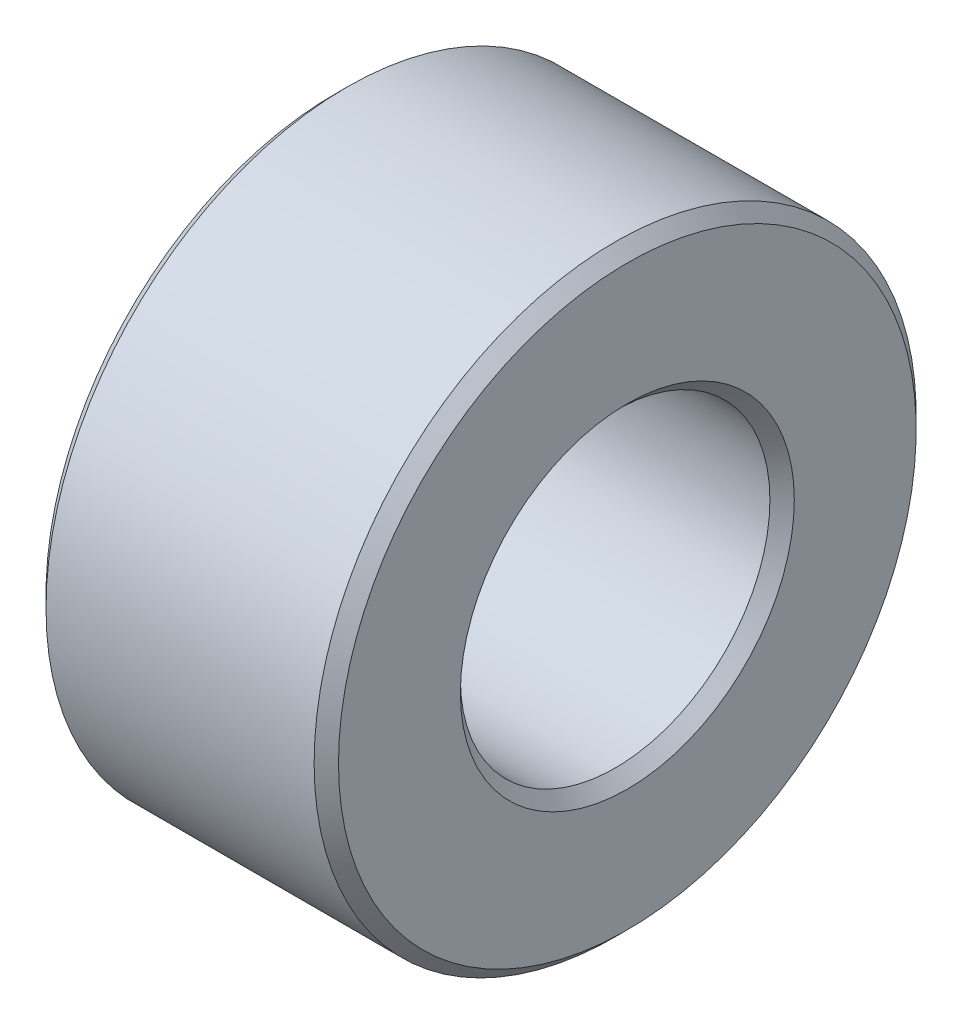
ISO-10303-21;
HEADER;
FILE_DESCRIPTION(('STEP AP214'),'2;1');
FILE_NAME('part.step','',(''),(''),'','','');
FILE_SCHEMA(('AUTOMOTIVE_DESIGN { 1 0 10303 214 1 1 1 1 }'));
ENDSEC;
DATA;
#1=APPLICATION_CONTEXT('core data for automotive mechanical design processes');
#2=APPLICATION_PROTOCOL_DEFINITION('international standard','automotive_design',2000,#1);
#3=PRODUCT_CONTEXT('',#1,'mechanical');
#4=PRODUCT('Part','Part','',(#3));
#5=PRODUCT_RELATED_PRODUCT_CATEGORY('part','',(#4));
#6=PRODUCT_DEFINITION_FORMATION('','',#4);
#7=PRODUCT_DEFINITION_CONTEXT('part definition',#1,'design');
#8=PRODUCT_DEFINITION('design','',#6,#7);
#9=PRODUCT_DEFINITION_SHAPE('','',#8);
#10=(LENGTH_UNIT() NAMED_UNIT(*) SI_UNIT(.MILLI.,.METRE.));
#11=(NAMED_UNIT(*) PLANE_ANGLE_UNIT() SI_UNIT($,.RADIAN.));
#12=(NAMED_UNIT(*) SI_UNIT($,.STERADIAN.) SOLID_ANGLE_UNIT());
#13=UNCERTAINTY_MEASURE_WITH_UNIT(LENGTH_MEASURE(1.E-05),#10,'distance_accuracy_value','');
#14=(GEOMETRIC_REPRESENTATION_CONTEXT(3) GLOBAL_UNCERTAINTY_ASSIGNED_CONTEXT((#13)) GLOBAL_UNIT_ASSIGNED_CONTEXT((#10,
#11,#12)) REPRESENTATION_CONTEXT('',''));
#15=CARTESIAN_POINT('',(0.,0.,0.));
#16=DIRECTION('',(0.,0.,1.));
#17=DIRECTION('',(1.,0.,0.));
#18=AXIS2_PLACEMENT_3D('',#15,#16,#17);
#19=CARTESIAN_POINT('',(-3.,3.175,0.));
#20=DIRECTION('',(1.,0.,0.));
#21=DIRECTION('',(0.,0.,-1.));
#22=AXIS2_PLACEMENT_3D('',#19,#20,#21);
#23=PLANE('',#22);
#24=CARTESIAN_POINT('',(-3.,0.,0.));
#25=DIRECTION('',(1.,0.,0.));
#26=DIRECTION('',(0.,0.,-1.));
#27=AXIS2_PLACEMENT_3D('',#24,#25,#26);
#28=CIRCLE('',#27,5.925);
#29=CARTESIAN_POINT('',(-3.,0.,-5.925));
#30=VERTEX_POINT('',#29);
#31=EDGE_CURVE('E58',#30,#30,#28,.F.);
#32=ORIENTED_EDGE('',*,*,#31,.T.);
#33=EDGE_LOOP('',(#32));
#34=FACE_BOUND('',#33,.T.);
#35=CARTESIAN_POINT('',(-3.,0.,0.));
#36=DIRECTION('',(1.,0.,0.));
#37=DIRECTION('',(0.,0.,-1.));
#38=AXIS2_PLACEMENT_3D('',#35,#36,#37);
#39=CIRCLE('',#38,3.425);
#40=CARTESIAN_POINT('',(-3.,0.,-3.425));
#41=VERTEX_POINT('',#40);
#42=EDGE_CURVE('E61',#41,#41,#39,.T.);
#43=ORIENTED_EDGE('',*,*,#42,.T.);
#44=EDGE_LOOP('',(#43));
#45=FACE_BOUND('',#44,.T.);
#46=ADVANCED_FACE('F32',(#34,#45),#23,.F.);
#47=CARTESIAN_POINT('',(0.,0.,0.));
#48=DIRECTION('',(-1.,0.,0.));
#49=DIRECTION('',(0.,0.,1.));
#50=AXIS2_PLACEMENT_3D('',#47,#48,#49);
#51=CYLINDRICAL_SURFACE('',#50,6.175);
#52=CARTESIAN_POINT('',(-2.75,0.,0.));
#53=DIRECTION('',(1.,0.,0.));
#54=DIRECTION('',(0.,0.,-1.));
#55=AXIS2_PLACEMENT_3D('',#52,#53,#54);
#56=CIRCLE('',#55,6.175);
#57=CARTESIAN_POINT('',(-2.75,0.,-6.175));
#58=VERTEX_POINT('',#57);
#59=EDGE_CURVE('E52',#58,#58,#56,.T.);
#60=ORIENTED_EDGE('',*,*,#59,.T.);
#61=EDGE_LOOP('',(#60));
#62=FACE_BOUND('',#61,.T.);
#63=CARTESIAN_POINT('',(2.75,0.,0.));
#64=DIRECTION('',(-1.,0.,0.));
#65=DIRECTION('',(0.,0.,1.));
#66=AXIS2_PLACEMENT_3D('',#63,#64,#65);
#67=CIRCLE('',#66,6.175);
#68=CARTESIAN_POINT('',(2.75,0.,6.175));
#69=VERTEX_POINT('',#68);
#70=EDGE_CURVE('E55',#69,#69,#67,.T.);
#71=ORIENTED_EDGE('',*,*,#70,.T.);
#72=EDGE_LOOP('',(#71));
#73=FACE_BOUND('',#72,.T.);
#74=ADVANCED_FACE('F88',(#62,#73),#51,.T.);
#75=CARTESIAN_POINT('',(3.,6.175,0.));
#76=DIRECTION('',(-1.,0.,0.));
#77=DIRECTION('',(0.,0.,1.));
#78=AXIS2_PLACEMENT_3D('',#75,#76,#77);
#79=PLANE('',#78);
#80=CARTESIAN_POINT('',(3.,0.,0.));
#81=DIRECTION('',(-1.,0.,0.));
#82=DIRECTION('',(0.,0.,1.));
#83=AXIS2_PLACEMENT_3D('',#80,#81,#82);
#84=CIRCLE('',#83,5.925);
#85=CARTESIAN_POINT('',(3.,0.,5.925));
#86=VERTEX_POINT('',#85);
#87=EDGE_CURVE('E10',#86,#86,#84,.F.);
#88=ORIENTED_EDGE('',*,*,#87,.T.);
#89=EDGE_LOOP('',(#88));
#90=FACE_BOUND('',#89,.T.);
#91=CARTESIAN_POINT('',(3.,0.,0.));
#92=DIRECTION('',(-1.,0.,0.));
#93=DIRECTION('',(0.,0.,1.));
#94=AXIS2_PLACEMENT_3D('',#91,#92,#93);
#95=CIRCLE('',#94,3.425);
#96=CARTESIAN_POINT('',(3.,0.,3.425));
#97=VERTEX_POINT('',#96);
#98=EDGE_CURVE('E39',#97,#97,#95,.T.);
#99=ORIENTED_EDGE('',*,*,#98,.T.);
#100=EDGE_LOOP('',(#99));
#101=FACE_BOUND('',#100,.T.);
#102=ADVANCED_FACE('F77',(#90,#101),#79,.F.);
#103=CARTESIAN_POINT('',(0.,0.,0.));
#104=DIRECTION('',(-1.,0.,0.));
#105=DIRECTION('',(0.,0.,1.));
#106=AXIS2_PLACEMENT_3D('',#103,#104,#105);
#107=CYLINDRICAL_SURFACE('',#106,3.175);
#108=CARTESIAN_POINT('',(-2.75,0.,0.));
#109=DIRECTION('',(1.,0.,0.));
#110=DIRECTION('',(0.,0.,-1.));
#111=AXIS2_PLACEMENT_3D('',#108,#109,#110);
#112=CIRCLE('',#111,3.175);
#113=CARTESIAN_POINT('',(-2.75,0.,-3.175));
#114=VERTEX_POINT('',#113);
#115=EDGE_CURVE('E43',#114,#114,#112,.F.);
#116=ORIENTED_EDGE('',*,*,#115,.T.);
#117=EDGE_LOOP('',(#116));
#118=FACE_BOUND('',#117,.T.);
#119=CARTESIAN_POINT('',(2.75,0.,0.));
#120=DIRECTION('',(-1.,0.,0.));
#121=DIRECTION('',(0.,0.,1.));
#122=AXIS2_PLACEMENT_3D('',#119,#120,#121);
#123=CIRCLE('',#122,3.175);
#124=CARTESIAN_POINT('',(2.75,0.,3.175));
#125=VERTEX_POINT('',#124);
#126=EDGE_CURVE('E47',#125,#125,#123,.F.);
#127=ORIENTED_EDGE('',*,*,#126,.T.);
#128=EDGE_LOOP('',(#127));
#129=FACE_BOUND('',#128,.T.);
#130=ADVANCED_FACE('F74',(#118,#129),#107,.F.);
#131=CARTESIAN_POINT('',(-3.,0.,0.));
#132=DIRECTION('',(1.,0.,0.));
#133=DIRECTION('',(0.,0.,-1.));
#134=AXIS2_PLACEMENT_3D('',#131,#132,#133);
#135=CONICAL_SURFACE('',#134,5.925,0.785398163397447);
#136=ORIENTED_EDGE('',*,*,#59,.F.);
#137=EDGE_LOOP('',(#136));
#138=FACE_BOUND('',#137,.T.);
#139=ORIENTED_EDGE('',*,*,#31,.F.);
#140=EDGE_LOOP('',(#139));
#141=FACE_BOUND('',#140,.T.);
#142=ADVANCED_FACE('F70',(#138,#141),#135,.T.);
#143=CARTESIAN_POINT('',(-2.75,0.,0.));
#144=DIRECTION('',(-1.,0.,0.));
#145=DIRECTION('',(0.,0.,1.));
#146=AXIS2_PLACEMENT_3D('',#143,#144,#145);
#147=CONICAL_SURFACE('',#146,3.175,0.785398163397447);
#148=ORIENTED_EDGE('',*,*,#42,.F.);
#149=EDGE_LOOP('',(#148));
#150=FACE_BOUND('',#149,.T.);
#151=ORIENTED_EDGE('',*,*,#115,.F.);
#152=EDGE_LOOP('',(#151));
#153=FACE_BOUND('',#152,.T.);
#154=ADVANCED_FACE('F66',(#150,#153),#147,.F.);
#155=CARTESIAN_POINT('',(2.75,0.,0.));
#156=DIRECTION('',(-1.,0.,0.));
#157=DIRECTION('',(0.,0.,1.));
#158=AXIS2_PLACEMENT_3D('',#155,#156,#157);
#159=CONICAL_SURFACE('',#158,6.175,0.78539816339745);
#160=ORIENTED_EDGE('',*,*,#87,.F.);
#161=EDGE_LOOP('',(#160));
#162=FACE_BOUND('',#161,.T.);
#163=ORIENTED_EDGE('',*,*,#70,.F.);
#164=EDGE_LOOP('',(#163));
#165=FACE_BOUND('',#164,.T.);
#166=ADVANCED_FACE('F69',(#162,#165),#159,.T.);
#167=CARTESIAN_POINT('',(3.,0.,0.));
#168=DIRECTION('',(1.,0.,0.));
#169=DIRECTION('',(0.,0.,-1.));
#170=AXIS2_PLACEMENT_3D('',#167,#168,#169);
#171=CONICAL_SURFACE('',#170,3.425,0.785398163397446);
#172=ORIENTED_EDGE('',*,*,#126,.F.);
#173=EDGE_LOOP('',(#172));
#174=FACE_BOUND('',#173,.T.);
#175=ORIENTED_EDGE('',*,*,#98,.F.);
#176=EDGE_LOOP('',(#175));
#177=FACE_BOUND('',#176,.T.);
#178=ADVANCED_FACE('F34',(#174,#177),#171,.F.);
#179=CLOSED_SHELL('',(#46,#74,#102,#130,#142,#154,#166,#178));
#180=MANIFOLD_SOLID_BREP('B2',#179);
#181=ADVANCED_BREP_SHAPE_REPRESENTATION('',(#18,#180),#14);
#182=SHAPE_DEFINITION_REPRESENTATION(#9,#181);
ENDSEC;
END-ISO-10303-21;
